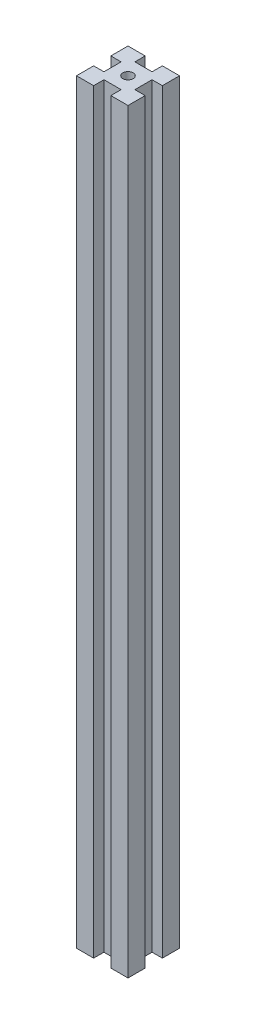
ISO-10303-21;
HEADER;
FILE_DESCRIPTION(('STEP AP214'),'2;1');
FILE_NAME('part.step','',(''),(''),'','','');
FILE_SCHEMA(('AUTOMOTIVE_DESIGN { 1 0 10303 214 1 1 1 1 }'));
ENDSEC;
DATA;
#1=APPLICATION_CONTEXT('core data for automotive mechanical design processes');
#2=APPLICATION_PROTOCOL_DEFINITION('international standard','automotive_design',2000,#1);
#3=PRODUCT_CONTEXT('',#1,'mechanical');
#4=PRODUCT('Part','Part','',(#3));
#5=PRODUCT_RELATED_PRODUCT_CATEGORY('part','',(#4));
#6=PRODUCT_DEFINITION_FORMATION('','',#4);
#7=PRODUCT_DEFINITION_CONTEXT('part definition',#1,'design');
#8=PRODUCT_DEFINITION('design','',#6,#7);
#9=PRODUCT_DEFINITION_SHAPE('','',#8);
#10=(LENGTH_UNIT() NAMED_UNIT(*) SI_UNIT(.MILLI.,.METRE.));
#11=(NAMED_UNIT(*) PLANE_ANGLE_UNIT() SI_UNIT($,.RADIAN.));
#12=(NAMED_UNIT(*) SI_UNIT($,.STERADIAN.) SOLID_ANGLE_UNIT());
#13=UNCERTAINTY_MEASURE_WITH_UNIT(LENGTH_MEASURE(1.E-05),#10,'distance_accuracy_value','');
#14=(GEOMETRIC_REPRESENTATION_CONTEXT(3) GLOBAL_UNCERTAINTY_ASSIGNED_CONTEXT((#13)) GLOBAL_UNIT_ASSIGNED_CONTEXT((#10,
#11,#12)) REPRESENTATION_CONTEXT('',''));
#15=CARTESIAN_POINT('',(0.,0.,0.));
#16=DIRECTION('',(0.,0.,1.));
#17=DIRECTION('',(1.,0.,0.));
#18=AXIS2_PLACEMENT_3D('',#15,#16,#17);
#19=CARTESIAN_POINT('',(0.,220.,0.));
#20=DIRECTION('',(0.,1.,0.));
#21=DIRECTION('',(0.,0.,1.));
#22=AXIS2_PLACEMENT_3D('',#19,#20,#21);
#23=PLANE('',#22);
#24=DIRECTION('',(-1.,0.,0.));
#25=VECTOR('',#24,1.);
#26=CARTESIAN_POINT('',(2.50000000000001,220.,-7.5));
#27=LINE('',#26,#25);
#28=CARTESIAN_POINT('',(7.5,220.,-7.5));
#29=VERTEX_POINT('',#28);
#30=CARTESIAN_POINT('',(2.50000000000001,220.,-7.5));
#31=VERTEX_POINT('',#30);
#32=EDGE_CURVE('E247',#29,#31,#27,.T.);
#33=ORIENTED_EDGE('',*,*,#32,.T.);
#34=DIRECTION('',(0.,0.,1.));
#35=VECTOR('',#34,1.);
#36=CARTESIAN_POINT('',(2.50000000000001,220.,-4.5));
#37=LINE('',#36,#35);
#38=CARTESIAN_POINT('',(2.50000000000001,220.,-4.5));
#39=VERTEX_POINT('',#38);
#40=EDGE_CURVE('E135',#31,#39,#37,.T.);
#41=ORIENTED_EDGE('',*,*,#40,.T.);
#42=DIRECTION('',(-1.,0.,0.));
#43=VECTOR('',#42,1.);
#44=CARTESIAN_POINT('',(-2.5,220.,-4.5));
#45=LINE('',#44,#43);
#46=CARTESIAN_POINT('',(-2.5,220.,-4.5));
#47=VERTEX_POINT('',#46);
#48=EDGE_CURVE('E298',#39,#47,#45,.T.);
#49=ORIENTED_EDGE('',*,*,#48,.T.);
#50=DIRECTION('',(0.,0.,-1.));
#51=VECTOR('',#50,1.);
#52=CARTESIAN_POINT('',(-2.5,220.,-7.5));
#53=LINE('',#52,#51);
#54=CARTESIAN_POINT('',(-2.5,220.,-7.5));
#55=VERTEX_POINT('',#54);
#56=EDGE_CURVE('E317',#47,#55,#53,.T.);
#57=ORIENTED_EDGE('',*,*,#56,.T.);
#58=DIRECTION('',(-1.,0.,0.));
#59=VECTOR('',#58,1.);
#60=CARTESIAN_POINT('',(-7.5,220.,-7.5));
#61=LINE('',#60,#59);
#62=CARTESIAN_POINT('',(-7.5,220.,-7.5));
#63=VERTEX_POINT('',#62);
#64=EDGE_CURVE('E314',#55,#63,#61,.T.);
#65=ORIENTED_EDGE('',*,*,#64,.T.);
#66=DIRECTION('',(0.,0.,1.));
#67=VECTOR('',#66,1.);
#68=CARTESIAN_POINT('',(-7.5,220.,-2.5));
#69=LINE('',#68,#67);
#70=CARTESIAN_POINT('',(-7.5,220.,-2.5));
#71=VERTEX_POINT('',#70);
#72=EDGE_CURVE('E316',#63,#71,#69,.T.);
#73=ORIENTED_EDGE('',*,*,#72,.T.);
#74=DIRECTION('',(1.,0.,0.));
#75=VECTOR('',#74,1.);
#76=CARTESIAN_POINT('',(-7.5,220.,-2.5));
#77=LINE('',#76,#75);
#78=CARTESIAN_POINT('',(-4.5,220.,-2.5));
#79=VERTEX_POINT('',#78);
#80=EDGE_CURVE('E319',#71,#79,#77,.T.);
#81=ORIENTED_EDGE('',*,*,#80,.T.);
#82=DIRECTION('',(0.,0.,1.));
#83=VECTOR('',#82,1.);
#84=CARTESIAN_POINT('',(-4.5,220.,-2.5));
#85=LINE('',#84,#83);
#86=CARTESIAN_POINT('',(-4.5,220.,2.5));
#87=VERTEX_POINT('',#86);
#88=EDGE_CURVE('E325',#79,#87,#85,.T.);
#89=ORIENTED_EDGE('',*,*,#88,.T.);
#90=DIRECTION('',(-1.,0.,0.));
#91=VECTOR('',#90,1.);
#92=CARTESIAN_POINT('',(-4.5,220.,2.5));
#93=LINE('',#92,#91);
#94=CARTESIAN_POINT('',(-7.5,220.,2.5));
#95=VERTEX_POINT('',#94);
#96=EDGE_CURVE('E327',#87,#95,#93,.T.);
#97=ORIENTED_EDGE('',*,*,#96,.T.);
#98=DIRECTION('',(0.,0.,1.));
#99=VECTOR('',#98,1.);
#100=CARTESIAN_POINT('',(-7.5,220.,7.5));
#101=LINE('',#100,#99);
#102=CARTESIAN_POINT('',(-7.5,220.,7.5));
#103=VERTEX_POINT('',#102);
#104=EDGE_CURVE('E329',#95,#103,#101,.T.);
#105=ORIENTED_EDGE('',*,*,#104,.T.);
#106=DIRECTION('',(1.,0.,0.));
#107=VECTOR('',#106,1.);
#108=CARTESIAN_POINT('',(-7.5,220.,7.5));
#109=LINE('',#108,#107);
#110=CARTESIAN_POINT('',(-2.5,220.,7.5));
#111=VERTEX_POINT('',#110);
#112=EDGE_CURVE('E331',#103,#111,#109,.T.);
#113=ORIENTED_EDGE('',*,*,#112,.T.);
#114=DIRECTION('',(0.,0.,-1.));
#115=VECTOR('',#114,1.);
#116=CARTESIAN_POINT('',(-2.5,220.,7.5));
#117=LINE('',#116,#115);
#118=CARTESIAN_POINT('',(-2.5,220.,4.5));
#119=VERTEX_POINT('',#118);
#120=EDGE_CURVE('E333',#111,#119,#117,.T.);
#121=ORIENTED_EDGE('',*,*,#120,.T.);
#122=DIRECTION('',(1.,0.,0.));
#123=VECTOR('',#122,1.);
#124=CARTESIAN_POINT('',(-2.5,220.,4.5));
#125=LINE('',#124,#123);
#126=CARTESIAN_POINT('',(2.5,220.,4.5));
#127=VERTEX_POINT('',#126);
#128=EDGE_CURVE('E335',#119,#127,#125,.T.);
#129=ORIENTED_EDGE('',*,*,#128,.T.);
#130=DIRECTION('',(0.,0.,1.));
#131=VECTOR('',#130,1.);
#132=CARTESIAN_POINT('',(2.5,220.,4.5));
#133=LINE('',#132,#131);
#134=CARTESIAN_POINT('',(2.5,220.,7.5));
#135=VERTEX_POINT('',#134);
#136=EDGE_CURVE('E337',#127,#135,#133,.T.);
#137=ORIENTED_EDGE('',*,*,#136,.T.);
#138=DIRECTION('',(1.,0.,0.));
#139=VECTOR('',#138,1.);
#140=CARTESIAN_POINT('',(2.5,220.,7.5));
#141=LINE('',#140,#139);
#142=CARTESIAN_POINT('',(7.5,220.,7.5));
#143=VERTEX_POINT('',#142);
#144=EDGE_CURVE('E339',#135,#143,#141,.T.);
#145=ORIENTED_EDGE('',*,*,#144,.T.);
#146=DIRECTION('',(0.,0.,-1.));
#147=VECTOR('',#146,1.);
#148=CARTESIAN_POINT('',(7.5,220.,7.5));
#149=LINE('',#148,#147);
#150=CARTESIAN_POINT('',(7.5,220.,2.5));
#151=VERTEX_POINT('',#150);
#152=EDGE_CURVE('E341',#143,#151,#149,.T.);
#153=ORIENTED_EDGE('',*,*,#152,.T.);
#154=DIRECTION('',(-1.,0.,0.));
#155=VECTOR('',#154,1.);
#156=CARTESIAN_POINT('',(4.49999999999999,220.,2.5));
#157=LINE('',#156,#155);
#158=CARTESIAN_POINT('',(4.49999999999999,220.,2.5));
#159=VERTEX_POINT('',#158);
#160=EDGE_CURVE('E190',#151,#159,#157,.T.);
#161=ORIENTED_EDGE('',*,*,#160,.T.);
#162=DIRECTION('',(0.,0.,-1.));
#163=VECTOR('',#162,1.);
#164=CARTESIAN_POINT('',(4.5,220.,-2.5));
#165=LINE('',#164,#163);
#166=CARTESIAN_POINT('',(4.5,220.,-2.5));
#167=VERTEX_POINT('',#166);
#168=EDGE_CURVE('E184',#159,#167,#165,.T.);
#169=ORIENTED_EDGE('',*,*,#168,.T.);
#170=DIRECTION('',(1.,0.,0.));
#171=VECTOR('',#170,1.);
#172=CARTESIAN_POINT('',(7.5,220.,-2.5));
#173=LINE('',#172,#171);
#174=CARTESIAN_POINT('',(7.5,220.,-2.5));
#175=VERTEX_POINT('',#174);
#176=EDGE_CURVE('E188',#167,#175,#173,.T.);
#177=ORIENTED_EDGE('',*,*,#176,.T.);
#178=DIRECTION('',(0.,0.,-1.));
#179=VECTOR('',#178,1.);
#180=CARTESIAN_POINT('',(7.5,220.,-2.5));
#181=LINE('',#180,#179);
#182=EDGE_CURVE('E56',#175,#29,#181,.T.);
#183=ORIENTED_EDGE('',*,*,#182,.T.);
#184=EDGE_LOOP('',(#33,#41,#49,#57,#65,#73,#81,#89,#97,#105,#113,#121,#129,#137,#145,#153,#161,
#169,#177,#183));
#185=FACE_BOUND('',#184,.T.);
#186=CARTESIAN_POINT('',(0.,220.,0.));
#187=DIRECTION('',(0.,1.,0.));
#188=DIRECTION('',(0.,0.,1.));
#189=AXIS2_PLACEMENT_3D('',#186,#187,#188);
#190=CIRCLE('',#189,1.5);
#191=CARTESIAN_POINT('',(0.,220.,1.5));
#192=VERTEX_POINT('',#191);
#193=EDGE_CURVE('E212',#192,#192,#190,.T.);
#194=ORIENTED_EDGE('',*,*,#193,.F.);
#195=EDGE_LOOP('',(#194));
#196=FACE_BOUND('',#195,.T.);
#197=ADVANCED_FACE('F39',(#185,#196),#23,.T.);
#198=CARTESIAN_POINT('',(0.,0.,0.));
#199=DIRECTION('',(0.,1.,0.));
#200=DIRECTION('',(0.,0.,1.));
#201=AXIS2_PLACEMENT_3D('',#198,#199,#200);
#202=PLANE('',#201);
#203=DIRECTION('',(-1.,0.,0.));
#204=VECTOR('',#203,1.);
#205=CARTESIAN_POINT('',(2.50000000000001,0.,-7.5));
#206=LINE('',#205,#204);
#207=CARTESIAN_POINT('',(7.5,0.,-7.5));
#208=VERTEX_POINT('',#207);
#209=CARTESIAN_POINT('',(2.50000000000001,0.,-7.5));
#210=VERTEX_POINT('',#209);
#211=EDGE_CURVE('E208',#208,#210,#206,.T.);
#212=ORIENTED_EDGE('',*,*,#211,.F.);
#213=DIRECTION('',(0.,0.,-1.));
#214=VECTOR('',#213,1.);
#215=CARTESIAN_POINT('',(7.5,0.,-2.5));
#216=LINE('',#215,#214);
#217=CARTESIAN_POINT('',(7.5,0.,-2.5));
#218=VERTEX_POINT('',#217);
#219=EDGE_CURVE('E127',#218,#208,#216,.T.);
#220=ORIENTED_EDGE('',*,*,#219,.F.);
#221=DIRECTION('',(1.,0.,0.));
#222=VECTOR('',#221,1.);
#223=CARTESIAN_POINT('',(7.5,0.,-2.5));
#224=LINE('',#223,#222);
#225=CARTESIAN_POINT('',(4.5,0.,-2.5));
#226=VERTEX_POINT('',#225);
#227=EDGE_CURVE('E121',#226,#218,#224,.T.);
#228=ORIENTED_EDGE('',*,*,#227,.F.);
#229=DIRECTION('',(0.,0.,-1.));
#230=VECTOR('',#229,1.);
#231=CARTESIAN_POINT('',(4.5,0.,-2.5));
#232=LINE('',#231,#230);
#233=CARTESIAN_POINT('',(4.49999999999999,0.,2.5));
#234=VERTEX_POINT('',#233);
#235=EDGE_CURVE('E198',#234,#226,#232,.T.);
#236=ORIENTED_EDGE('',*,*,#235,.F.);
#237=DIRECTION('',(-1.,0.,0.));
#238=VECTOR('',#237,1.);
#239=CARTESIAN_POINT('',(4.49999999999999,0.,2.5));
#240=LINE('',#239,#238);
#241=CARTESIAN_POINT('',(7.5,0.,2.5));
#242=VERTEX_POINT('',#241);
#243=EDGE_CURVE('E242',#242,#234,#240,.T.);
#244=ORIENTED_EDGE('',*,*,#243,.F.);
#245=DIRECTION('',(0.,0.,-1.));
#246=VECTOR('',#245,1.);
#247=CARTESIAN_POINT('',(7.5,0.,7.5));
#248=LINE('',#247,#246);
#249=CARTESIAN_POINT('',(7.5,0.,7.5));
#250=VERTEX_POINT('',#249);
#251=EDGE_CURVE('E240',#250,#242,#248,.T.);
#252=ORIENTED_EDGE('',*,*,#251,.F.);
#253=DIRECTION('',(1.,0.,0.));
#254=VECTOR('',#253,1.);
#255=CARTESIAN_POINT('',(2.5,0.,7.5));
#256=LINE('',#255,#254);
#257=CARTESIAN_POINT('',(2.5,0.,7.5));
#258=VERTEX_POINT('',#257);
#259=EDGE_CURVE('E238',#258,#250,#256,.T.);
#260=ORIENTED_EDGE('',*,*,#259,.F.);
#261=DIRECTION('',(0.,0.,1.));
#262=VECTOR('',#261,1.);
#263=CARTESIAN_POINT('',(2.5,0.,4.5));
#264=LINE('',#263,#262);
#265=CARTESIAN_POINT('',(2.5,0.,4.5));
#266=VERTEX_POINT('',#265);
#267=EDGE_CURVE('E236',#266,#258,#264,.T.);
#268=ORIENTED_EDGE('',*,*,#267,.F.);
#269=DIRECTION('',(1.,0.,0.));
#270=VECTOR('',#269,1.);
#271=CARTESIAN_POINT('',(-2.5,0.,4.5));
#272=LINE('',#271,#270);
#273=CARTESIAN_POINT('',(-2.5,0.,4.5));
#274=VERTEX_POINT('',#273);
#275=EDGE_CURVE('E234',#274,#266,#272,.T.);
#276=ORIENTED_EDGE('',*,*,#275,.F.);
#277=DIRECTION('',(0.,0.,-1.));
#278=VECTOR('',#277,1.);
#279=CARTESIAN_POINT('',(-2.5,0.,7.5));
#280=LINE('',#279,#278);
#281=CARTESIAN_POINT('',(-2.5,0.,7.5));
#282=VERTEX_POINT('',#281);
#283=EDGE_CURVE('E232',#282,#274,#280,.T.);
#284=ORIENTED_EDGE('',*,*,#283,.F.);
#285=DIRECTION('',(1.,0.,0.));
#286=VECTOR('',#285,1.);
#287=CARTESIAN_POINT('',(-7.5,0.,7.5));
#288=LINE('',#287,#286);
#289=CARTESIAN_POINT('',(-7.5,0.,7.5));
#290=VERTEX_POINT('',#289);
#291=EDGE_CURVE('E230',#290,#282,#288,.T.);
#292=ORIENTED_EDGE('',*,*,#291,.F.);
#293=DIRECTION('',(0.,0.,1.));
#294=VECTOR('',#293,1.);
#295=CARTESIAN_POINT('',(-7.5,0.,7.5));
#296=LINE('',#295,#294);
#297=CARTESIAN_POINT('',(-7.5,0.,2.5));
#298=VERTEX_POINT('',#297);
#299=EDGE_CURVE('E228',#298,#290,#296,.T.);
#300=ORIENTED_EDGE('',*,*,#299,.F.);
#301=DIRECTION('',(-1.,0.,0.));
#302=VECTOR('',#301,1.);
#303=CARTESIAN_POINT('',(-4.5,0.,2.5));
#304=LINE('',#303,#302);
#305=CARTESIAN_POINT('',(-4.5,0.,2.5));
#306=VERTEX_POINT('',#305);
#307=EDGE_CURVE('E226',#306,#298,#304,.T.);
#308=ORIENTED_EDGE('',*,*,#307,.F.);
#309=DIRECTION('',(0.,0.,1.));
#310=VECTOR('',#309,1.);
#311=CARTESIAN_POINT('',(-4.5,0.,-2.5));
#312=LINE('',#311,#310);
#313=CARTESIAN_POINT('',(-4.5,0.,-2.5));
#314=VERTEX_POINT('',#313);
#315=EDGE_CURVE('E224',#314,#306,#312,.T.);
#316=ORIENTED_EDGE('',*,*,#315,.F.);
#317=DIRECTION('',(1.,0.,0.));
#318=VECTOR('',#317,1.);
#319=CARTESIAN_POINT('',(-7.5,0.,-2.5));
#320=LINE('',#319,#318);
#321=CARTESIAN_POINT('',(-7.5,0.,-2.5));
#322=VERTEX_POINT('',#321);
#323=EDGE_CURVE('E222',#322,#314,#320,.T.);
#324=ORIENTED_EDGE('',*,*,#323,.F.);
#325=DIRECTION('',(0.,0.,1.));
#326=VECTOR('',#325,1.);
#327=CARTESIAN_POINT('',(-7.5,0.,-2.5));
#328=LINE('',#327,#326);
#329=CARTESIAN_POINT('',(-7.5,0.,-7.5));
#330=VERTEX_POINT('',#329);
#331=EDGE_CURVE('E220',#330,#322,#328,.T.);
#332=ORIENTED_EDGE('',*,*,#331,.F.);
#333=DIRECTION('',(-1.,0.,0.));
#334=VECTOR('',#333,1.);
#335=CARTESIAN_POINT('',(-7.5,0.,-7.5));
#336=LINE('',#335,#334);
#337=CARTESIAN_POINT('',(-2.5,0.,-7.5));
#338=VERTEX_POINT('',#337);
#339=EDGE_CURVE('E218',#338,#330,#336,.T.);
#340=ORIENTED_EDGE('',*,*,#339,.F.);
#341=DIRECTION('',(0.,0.,-1.));
#342=VECTOR('',#341,1.);
#343=CARTESIAN_POINT('',(-2.5,0.,-7.5));
#344=LINE('',#343,#342);
#345=CARTESIAN_POINT('',(-2.5,0.,-4.5));
#346=VERTEX_POINT('',#345);
#347=EDGE_CURVE('E216',#346,#338,#344,.T.);
#348=ORIENTED_EDGE('',*,*,#347,.F.);
#349=DIRECTION('',(-1.,0.,0.));
#350=VECTOR('',#349,1.);
#351=CARTESIAN_POINT('',(-2.5,0.,-4.5));
#352=LINE('',#351,#350);
#353=CARTESIAN_POINT('',(2.50000000000001,0.,-4.5));
#354=VERTEX_POINT('',#353);
#355=EDGE_CURVE('E214',#354,#346,#352,.T.);
#356=ORIENTED_EDGE('',*,*,#355,.F.);
#357=DIRECTION('',(0.,0.,1.));
#358=VECTOR('',#357,1.);
#359=CARTESIAN_POINT('',(2.50000000000001,0.,-4.5));
#360=LINE('',#359,#358);
#361=EDGE_CURVE('E211',#210,#354,#360,.T.);
#362=ORIENTED_EDGE('',*,*,#361,.F.);
#363=EDGE_LOOP('',(#212,#220,#228,#236,#244,#252,#260,#268,#276,#284,#292,#300,#308,#316,#324,
#332,#340,#348,#356,#362));
#364=FACE_BOUND('',#363,.T.);
#365=CARTESIAN_POINT('',(0.,0.,0.));
#366=DIRECTION('',(0.,1.,0.));
#367=DIRECTION('',(0.,0.,1.));
#368=AXIS2_PLACEMENT_3D('',#365,#366,#367);
#369=CIRCLE('',#368,1.5);
#370=CARTESIAN_POINT('',(0.,0.,1.5));
#371=VERTEX_POINT('',#370);
#372=EDGE_CURVE('E592',#371,#371,#369,.T.);
#373=ORIENTED_EDGE('',*,*,#372,.T.);
#374=EDGE_LOOP('',(#373));
#375=FACE_BOUND('',#374,.T.);
#376=ADVANCED_FACE('F302',(#364,#375),#202,.F.);
#377=CARTESIAN_POINT('',(2.50000000000001,220.,-7.5));
#378=DIRECTION('',(0.,0.,1.));
#379=DIRECTION('',(1.,0.,0.));
#380=AXIS2_PLACEMENT_3D('',#377,#378,#379);
#381=PLANE('',#380);
#382=ORIENTED_EDGE('',*,*,#211,.T.);
#383=DIRECTION('',(0.,-1.,0.));
#384=VECTOR('',#383,1.);
#385=CARTESIAN_POINT('',(2.50000000000001,220.,-7.5));
#386=LINE('',#385,#384);
#387=EDGE_CURVE('E11',#31,#210,#386,.T.);
#388=ORIENTED_EDGE('',*,*,#387,.F.);
#389=ORIENTED_EDGE('',*,*,#32,.F.);
#390=DIRECTION('',(0.,-1.,0.));
#391=VECTOR('',#390,1.);
#392=CARTESIAN_POINT('',(7.5,220.,-7.5));
#393=LINE('',#392,#391);
#394=EDGE_CURVE('E204',#29,#208,#393,.T.);
#395=ORIENTED_EDGE('',*,*,#394,.T.);
#396=EDGE_LOOP('',(#382,#388,#389,#395));
#397=FACE_BOUND('',#396,.T.);
#398=ADVANCED_FACE('F41',(#397),#381,.F.);
#399=CARTESIAN_POINT('',(2.50000000000001,220.,-4.5));
#400=DIRECTION('',(1.,0.,0.));
#401=DIRECTION('',(0.,0.,-1.));
#402=AXIS2_PLACEMENT_3D('',#399,#400,#401);
#403=PLANE('',#402);
#404=ORIENTED_EDGE('',*,*,#361,.T.);
#405=DIRECTION('',(0.,-1.,0.));
#406=VECTOR('',#405,1.);
#407=CARTESIAN_POINT('',(2.50000000000001,220.,-4.5));
#408=LINE('',#407,#406);
#409=EDGE_CURVE('E48',#39,#354,#408,.T.);
#410=ORIENTED_EDGE('',*,*,#409,.F.);
#411=ORIENTED_EDGE('',*,*,#40,.F.);
#412=ORIENTED_EDGE('',*,*,#387,.T.);
#413=EDGE_LOOP('',(#404,#410,#411,#412));
#414=FACE_BOUND('',#413,.T.);
#415=ADVANCED_FACE('F375',(#414),#403,.F.);
#416=CARTESIAN_POINT('',(-2.5,220.,-4.5));
#417=DIRECTION('',(0.,0.,1.));
#418=DIRECTION('',(1.,0.,0.));
#419=AXIS2_PLACEMENT_3D('',#416,#417,#418);
#420=PLANE('',#419);
#421=ORIENTED_EDGE('',*,*,#355,.T.);
#422=DIRECTION('',(0.,-1.,0.));
#423=VECTOR('',#422,1.);
#424=CARTESIAN_POINT('',(-2.5,220.,-4.5));
#425=LINE('',#424,#423);
#426=EDGE_CURVE('E290',#47,#346,#425,.T.);
#427=ORIENTED_EDGE('',*,*,#426,.F.);
#428=ORIENTED_EDGE('',*,*,#48,.F.);
#429=ORIENTED_EDGE('',*,*,#409,.T.);
#430=EDGE_LOOP('',(#421,#427,#428,#429));
#431=FACE_BOUND('',#430,.T.);
#432=ADVANCED_FACE('F296',(#431),#420,.F.);
#433=CARTESIAN_POINT('',(-2.5,220.,-7.5));
#434=DIRECTION('',(-1.,0.,0.));
#435=DIRECTION('',(0.,0.,1.));
#436=AXIS2_PLACEMENT_3D('',#433,#434,#435);
#437=PLANE('',#436);
#438=ORIENTED_EDGE('',*,*,#347,.T.);
#439=DIRECTION('',(0.,-1.,0.));
#440=VECTOR('',#439,1.);
#441=CARTESIAN_POINT('',(-2.5,220.,-7.5));
#442=LINE('',#441,#440);
#443=EDGE_CURVE('E287',#55,#338,#442,.T.);
#444=ORIENTED_EDGE('',*,*,#443,.F.);
#445=ORIENTED_EDGE('',*,*,#56,.F.);
#446=ORIENTED_EDGE('',*,*,#426,.T.);
#447=EDGE_LOOP('',(#438,#444,#445,#446));
#448=FACE_BOUND('',#447,.T.);
#449=ADVANCED_FACE('F308',(#448),#437,.F.);
#450=CARTESIAN_POINT('',(-7.5,220.,-7.5));
#451=DIRECTION('',(0.,0.,1.));
#452=DIRECTION('',(1.,0.,0.));
#453=AXIS2_PLACEMENT_3D('',#450,#451,#452);
#454=PLANE('',#453);
#455=ORIENTED_EDGE('',*,*,#339,.T.);
#456=DIRECTION('',(0.,-1.,0.));
#457=VECTOR('',#456,1.);
#458=CARTESIAN_POINT('',(-7.5,220.,-7.5));
#459=LINE('',#458,#457);
#460=EDGE_CURVE('E284',#63,#330,#459,.T.);
#461=ORIENTED_EDGE('',*,*,#460,.F.);
#462=ORIENTED_EDGE('',*,*,#64,.F.);
#463=ORIENTED_EDGE('',*,*,#443,.T.);
#464=EDGE_LOOP('',(#455,#461,#462,#463));
#465=FACE_BOUND('',#464,.T.);
#466=ADVANCED_FACE('F312',(#465),#454,.F.);
#467=CARTESIAN_POINT('',(-7.5,220.,-2.5));
#468=DIRECTION('',(1.,0.,0.));
#469=DIRECTION('',(0.,0.,-1.));
#470=AXIS2_PLACEMENT_3D('',#467,#468,#469);
#471=PLANE('',#470);
#472=ORIENTED_EDGE('',*,*,#331,.T.);
#473=DIRECTION('',(0.,-1.,0.));
#474=VECTOR('',#473,1.);
#475=CARTESIAN_POINT('',(-7.5,220.,-2.5));
#476=LINE('',#475,#474);
#477=EDGE_CURVE('E281',#71,#322,#476,.T.);
#478=ORIENTED_EDGE('',*,*,#477,.F.);
#479=ORIENTED_EDGE('',*,*,#72,.F.);
#480=ORIENTED_EDGE('',*,*,#460,.T.);
#481=EDGE_LOOP('',(#472,#478,#479,#480));
#482=FACE_BOUND('',#481,.T.);
#483=ADVANCED_FACE('F388',(#482),#471,.F.);
#484=CARTESIAN_POINT('',(-7.5,220.,-2.5));
#485=DIRECTION('',(0.,0.,-1.));
#486=DIRECTION('',(-1.,0.,0.));
#487=AXIS2_PLACEMENT_3D('',#484,#485,#486);
#488=PLANE('',#487);
#489=ORIENTED_EDGE('',*,*,#323,.T.);
#490=DIRECTION('',(0.,-1.,0.));
#491=VECTOR('',#490,1.);
#492=CARTESIAN_POINT('',(-4.5,220.,-2.5));
#493=LINE('',#492,#491);
#494=EDGE_CURVE('E278',#79,#314,#493,.T.);
#495=ORIENTED_EDGE('',*,*,#494,.F.);
#496=ORIENTED_EDGE('',*,*,#80,.F.);
#497=ORIENTED_EDGE('',*,*,#477,.T.);
#498=EDGE_LOOP('',(#489,#495,#496,#497));
#499=FACE_BOUND('',#498,.T.);
#500=ADVANCED_FACE('F391',(#499),#488,.F.);
#501=CARTESIAN_POINT('',(-4.5,220.,-2.5));
#502=DIRECTION('',(1.,0.,0.));
#503=DIRECTION('',(0.,0.,-1.));
#504=AXIS2_PLACEMENT_3D('',#501,#502,#503);
#505=PLANE('',#504);
#506=ORIENTED_EDGE('',*,*,#315,.T.);
#507=DIRECTION('',(0.,-1.,0.));
#508=VECTOR('',#507,1.);
#509=CARTESIAN_POINT('',(-4.5,220.,2.5));
#510=LINE('',#509,#508);
#511=EDGE_CURVE('E275',#87,#306,#510,.T.);
#512=ORIENTED_EDGE('',*,*,#511,.F.);
#513=ORIENTED_EDGE('',*,*,#88,.F.);
#514=ORIENTED_EDGE('',*,*,#494,.T.);
#515=EDGE_LOOP('',(#506,#512,#513,#514));
#516=FACE_BOUND('',#515,.T.);
#517=ADVANCED_FACE('F395',(#516),#505,.F.);
#518=CARTESIAN_POINT('',(-4.5,220.,2.5));
#519=DIRECTION('',(0.,0.,1.));
#520=DIRECTION('',(1.,0.,0.));
#521=AXIS2_PLACEMENT_3D('',#518,#519,#520);
#522=PLANE('',#521);
#523=ORIENTED_EDGE('',*,*,#307,.T.);
#524=DIRECTION('',(0.,-1.,0.));
#525=VECTOR('',#524,1.);
#526=CARTESIAN_POINT('',(-7.5,220.,2.5));
#527=LINE('',#526,#525);
#528=EDGE_CURVE('E272',#95,#298,#527,.T.);
#529=ORIENTED_EDGE('',*,*,#528,.F.);
#530=ORIENTED_EDGE('',*,*,#96,.F.);
#531=ORIENTED_EDGE('',*,*,#511,.T.);
#532=EDGE_LOOP('',(#523,#529,#530,#531));
#533=FACE_BOUND('',#532,.T.);
#534=ADVANCED_FACE('F399',(#533),#522,.F.);
#535=CARTESIAN_POINT('',(-7.5,220.,7.5));
#536=DIRECTION('',(1.,0.,0.));
#537=DIRECTION('',(0.,0.,-1.));
#538=AXIS2_PLACEMENT_3D('',#535,#536,#537);
#539=PLANE('',#538);
#540=ORIENTED_EDGE('',*,*,#299,.T.);
#541=DIRECTION('',(0.,-1.,0.));
#542=VECTOR('',#541,1.);
#543=CARTESIAN_POINT('',(-7.5,220.,7.5));
#544=LINE('',#543,#542);
#545=EDGE_CURVE('E269',#103,#290,#544,.T.);
#546=ORIENTED_EDGE('',*,*,#545,.F.);
#547=ORIENTED_EDGE('',*,*,#104,.F.);
#548=ORIENTED_EDGE('',*,*,#528,.T.);
#549=EDGE_LOOP('',(#540,#546,#547,#548));
#550=FACE_BOUND('',#549,.T.);
#551=ADVANCED_FACE('F403',(#550),#539,.F.);
#552=CARTESIAN_POINT('',(-7.5,220.,7.5));
#553=DIRECTION('',(0.,0.,-1.));
#554=DIRECTION('',(-1.,0.,0.));
#555=AXIS2_PLACEMENT_3D('',#552,#553,#554);
#556=PLANE('',#555);
#557=ORIENTED_EDGE('',*,*,#291,.T.);
#558=DIRECTION('',(0.,-1.,0.));
#559=VECTOR('',#558,1.);
#560=CARTESIAN_POINT('',(-2.5,220.,7.5));
#561=LINE('',#560,#559);
#562=EDGE_CURVE('E266',#111,#282,#561,.T.);
#563=ORIENTED_EDGE('',*,*,#562,.F.);
#564=ORIENTED_EDGE('',*,*,#112,.F.);
#565=ORIENTED_EDGE('',*,*,#545,.T.);
#566=EDGE_LOOP('',(#557,#563,#564,#565));
#567=FACE_BOUND('',#566,.T.);
#568=ADVANCED_FACE('F407',(#567),#556,.F.);
#569=CARTESIAN_POINT('',(-2.5,220.,7.5));
#570=DIRECTION('',(-1.,0.,0.));
#571=DIRECTION('',(0.,0.,1.));
#572=AXIS2_PLACEMENT_3D('',#569,#570,#571);
#573=PLANE('',#572);
#574=ORIENTED_EDGE('',*,*,#283,.T.);
#575=DIRECTION('',(0.,-1.,0.));
#576=VECTOR('',#575,1.);
#577=CARTESIAN_POINT('',(-2.5,220.,4.5));
#578=LINE('',#577,#576);
#579=EDGE_CURVE('E263',#119,#274,#578,.T.);
#580=ORIENTED_EDGE('',*,*,#579,.F.);
#581=ORIENTED_EDGE('',*,*,#120,.F.);
#582=ORIENTED_EDGE('',*,*,#562,.T.);
#583=EDGE_LOOP('',(#574,#580,#581,#582));
#584=FACE_BOUND('',#583,.T.);
#585=ADVANCED_FACE('F411',(#584),#573,.F.);
#586=CARTESIAN_POINT('',(-2.5,220.,4.5));
#587=DIRECTION('',(0.,0.,-1.));
#588=DIRECTION('',(-1.,0.,0.));
#589=AXIS2_PLACEMENT_3D('',#586,#587,#588);
#590=PLANE('',#589);
#591=ORIENTED_EDGE('',*,*,#275,.T.);
#592=DIRECTION('',(0.,-1.,0.));
#593=VECTOR('',#592,1.);
#594=CARTESIAN_POINT('',(2.5,220.,4.5));
#595=LINE('',#594,#593);
#596=EDGE_CURVE('E260',#127,#266,#595,.T.);
#597=ORIENTED_EDGE('',*,*,#596,.F.);
#598=ORIENTED_EDGE('',*,*,#128,.F.);
#599=ORIENTED_EDGE('',*,*,#579,.T.);
#600=EDGE_LOOP('',(#591,#597,#598,#599));
#601=FACE_BOUND('',#600,.T.);
#602=ADVANCED_FACE('F415',(#601),#590,.F.);
#603=CARTESIAN_POINT('',(2.5,220.,4.5));
#604=DIRECTION('',(1.,0.,0.));
#605=DIRECTION('',(0.,0.,-1.));
#606=AXIS2_PLACEMENT_3D('',#603,#604,#605);
#607=PLANE('',#606);
#608=ORIENTED_EDGE('',*,*,#267,.T.);
#609=DIRECTION('',(0.,-1.,0.));
#610=VECTOR('',#609,1.);
#611=CARTESIAN_POINT('',(2.5,220.,7.5));
#612=LINE('',#611,#610);
#613=EDGE_CURVE('E257',#135,#258,#612,.T.);
#614=ORIENTED_EDGE('',*,*,#613,.F.);
#615=ORIENTED_EDGE('',*,*,#136,.F.);
#616=ORIENTED_EDGE('',*,*,#596,.T.);
#617=EDGE_LOOP('',(#608,#614,#615,#616));
#618=FACE_BOUND('',#617,.T.);
#619=ADVANCED_FACE('F419',(#618),#607,.F.);
#620=CARTESIAN_POINT('',(2.5,220.,7.5));
#621=DIRECTION('',(0.,0.,-1.));
#622=DIRECTION('',(-1.,0.,0.));
#623=AXIS2_PLACEMENT_3D('',#620,#621,#622);
#624=PLANE('',#623);
#625=ORIENTED_EDGE('',*,*,#259,.T.);
#626=DIRECTION('',(0.,-1.,0.));
#627=VECTOR('',#626,1.);
#628=CARTESIAN_POINT('',(7.5,220.,7.5));
#629=LINE('',#628,#627);
#630=EDGE_CURVE('E254',#143,#250,#629,.T.);
#631=ORIENTED_EDGE('',*,*,#630,.F.);
#632=ORIENTED_EDGE('',*,*,#144,.F.);
#633=ORIENTED_EDGE('',*,*,#613,.T.);
#634=EDGE_LOOP('',(#625,#631,#632,#633));
#635=FACE_BOUND('',#634,.T.);
#636=ADVANCED_FACE('F423',(#635),#624,.F.);
#637=CARTESIAN_POINT('',(7.5,220.,7.5));
#638=DIRECTION('',(-1.,0.,0.));
#639=DIRECTION('',(0.,0.,1.));
#640=AXIS2_PLACEMENT_3D('',#637,#638,#639);
#641=PLANE('',#640);
#642=ORIENTED_EDGE('',*,*,#251,.T.);
#643=DIRECTION('',(0.,-1.,0.));
#644=VECTOR('',#643,1.);
#645=CARTESIAN_POINT('',(7.5,220.,2.5));
#646=LINE('',#645,#644);
#647=EDGE_CURVE('E251',#151,#242,#646,.T.);
#648=ORIENTED_EDGE('',*,*,#647,.F.);
#649=ORIENTED_EDGE('',*,*,#152,.F.);
#650=ORIENTED_EDGE('',*,*,#630,.T.);
#651=EDGE_LOOP('',(#642,#648,#649,#650));
#652=FACE_BOUND('',#651,.T.);
#653=ADVANCED_FACE('F347',(#652),#641,.F.);
#654=CARTESIAN_POINT('',(4.49999999999999,220.,2.5));
#655=DIRECTION('',(0.,0.,1.));
#656=DIRECTION('',(1.,0.,0.));
#657=AXIS2_PLACEMENT_3D('',#654,#655,#656);
#658=PLANE('',#657);
#659=ORIENTED_EDGE('',*,*,#243,.T.);
#660=DIRECTION('',(0.,-1.,0.));
#661=VECTOR('',#660,1.);
#662=CARTESIAN_POINT('',(4.49999999999999,220.,2.5));
#663=LINE('',#662,#661);
#664=EDGE_CURVE('E199',#159,#234,#663,.T.);
#665=ORIENTED_EDGE('',*,*,#664,.F.);
#666=ORIENTED_EDGE('',*,*,#160,.F.);
#667=ORIENTED_EDGE('',*,*,#647,.T.);
#668=EDGE_LOOP('',(#659,#665,#666,#667));
#669=FACE_BOUND('',#668,.T.);
#670=ADVANCED_FACE('F351',(#669),#658,.F.);
#671=CARTESIAN_POINT('',(4.5,220.,-2.5));
#672=DIRECTION('',(-1.,0.,0.));
#673=DIRECTION('',(0.,0.,1.));
#674=AXIS2_PLACEMENT_3D('',#671,#672,#673);
#675=PLANE('',#674);
#676=ORIENTED_EDGE('',*,*,#235,.T.);
#677=DIRECTION('',(0.,-1.,0.));
#678=VECTOR('',#677,1.);
#679=CARTESIAN_POINT('',(4.5,220.,-2.5));
#680=LINE('',#679,#678);
#681=EDGE_CURVE('E195',#167,#226,#680,.T.);
#682=ORIENTED_EDGE('',*,*,#681,.F.);
#683=ORIENTED_EDGE('',*,*,#168,.F.);
#684=ORIENTED_EDGE('',*,*,#664,.T.);
#685=EDGE_LOOP('',(#676,#682,#683,#684));
#686=FACE_BOUND('',#685,.T.);
#687=ADVANCED_FACE('F196',(#686),#675,.F.);
#688=CARTESIAN_POINT('',(7.5,220.,-2.5));
#689=DIRECTION('',(0.,0.,-1.));
#690=DIRECTION('',(-1.,0.,0.));
#691=AXIS2_PLACEMENT_3D('',#688,#689,#690);
#692=PLANE('',#691);
#693=ORIENTED_EDGE('',*,*,#227,.T.);
#694=DIRECTION('',(0.,-1.,0.));
#695=VECTOR('',#694,1.);
#696=CARTESIAN_POINT('',(7.5,220.,-2.5));
#697=LINE('',#696,#695);
#698=EDGE_CURVE('E200',#175,#218,#697,.T.);
#699=ORIENTED_EDGE('',*,*,#698,.F.);
#700=ORIENTED_EDGE('',*,*,#176,.F.);
#701=ORIENTED_EDGE('',*,*,#681,.T.);
#702=EDGE_LOOP('',(#693,#699,#700,#701));
#703=FACE_BOUND('',#702,.T.);
#704=ADVANCED_FACE('F202',(#703),#692,.F.);
#705=CARTESIAN_POINT('',(7.5,220.,-2.5));
#706=DIRECTION('',(-1.,0.,0.));
#707=DIRECTION('',(0.,0.,1.));
#708=AXIS2_PLACEMENT_3D('',#705,#706,#707);
#709=PLANE('',#708);
#710=ORIENTED_EDGE('',*,*,#219,.T.);
#711=ORIENTED_EDGE('',*,*,#394,.F.);
#712=ORIENTED_EDGE('',*,*,#182,.F.);
#713=ORIENTED_EDGE('',*,*,#698,.T.);
#714=EDGE_LOOP('',(#710,#711,#712,#713));
#715=FACE_BOUND('',#714,.T.);
#716=ADVANCED_FACE('F355',(#715),#709,.F.);
#717=CARTESIAN_POINT('',(0.,220.,0.));
#718=DIRECTION('',(0.,-1.,0.));
#719=DIRECTION('',(0.,0.,-1.));
#720=AXIS2_PLACEMENT_3D('',#717,#718,#719);
#721=CYLINDRICAL_SURFACE('',#720,1.5);
#722=ORIENTED_EDGE('',*,*,#193,.T.);
#723=EDGE_LOOP('',(#722));
#724=FACE_BOUND('',#723,.T.);
#725=ORIENTED_EDGE('',*,*,#372,.F.);
#726=EDGE_LOOP('',(#725));
#727=FACE_BOUND('',#726,.T.);
#728=ADVANCED_FACE('F357',(#724,#727),#721,.F.);
#729=CLOSED_SHELL('',(#197,#376,#398,#415,#432,#449,#466,#483,#500,#517,#534,#551,#568,#585,
#602,#619,#636,#653,#670,#687,#704,#716,#728));
#730=MANIFOLD_SOLID_BREP('B2',#729);
#731=ADVANCED_BREP_SHAPE_REPRESENTATION('',(#18,#730),#14);
#732=SHAPE_DEFINITION_REPRESENTATION(#9,#731);
ENDSEC;
END-ISO-10303-21;
